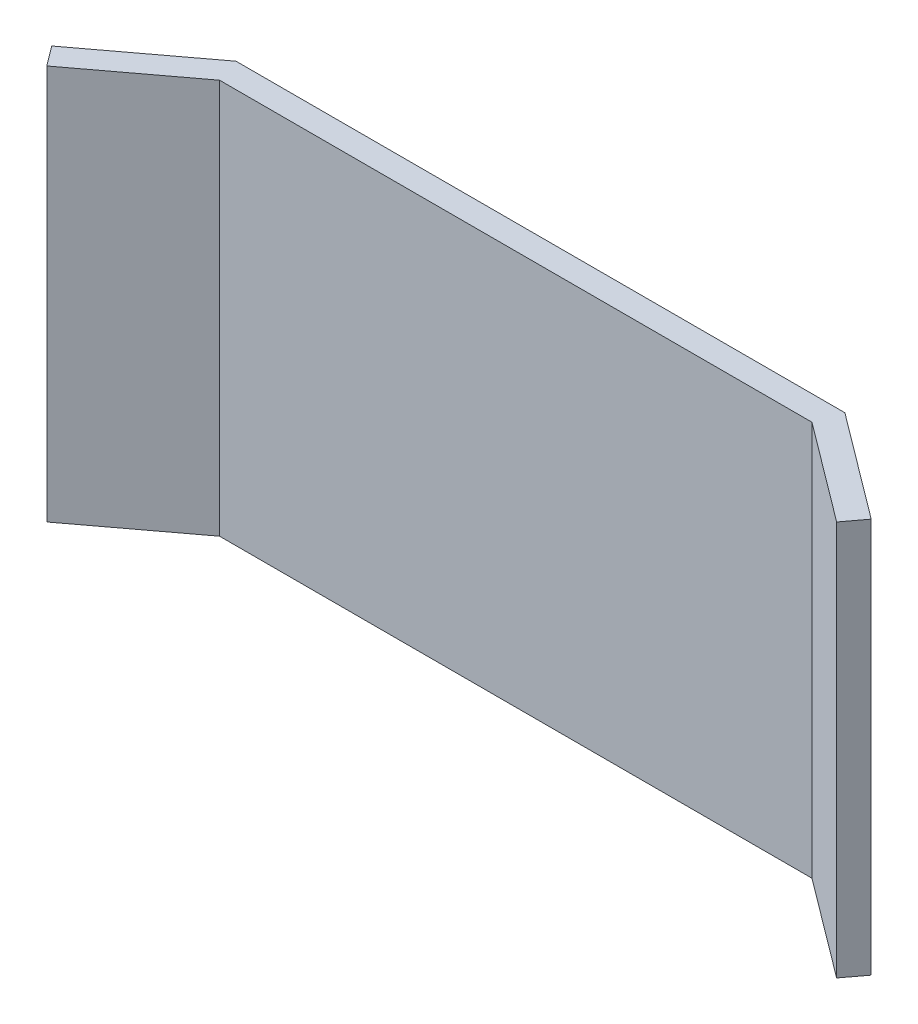
ISO-10303-21;
HEADER;
FILE_DESCRIPTION(('STEP AP214'),'2;1');
FILE_NAME('part.step','',(''),(''),'','','');
FILE_SCHEMA(('AUTOMOTIVE_DESIGN { 1 0 10303 214 1 1 1 1 }'));
ENDSEC;
DATA;
#1=APPLICATION_CONTEXT('core data for automotive mechanical design processes');
#2=APPLICATION_PROTOCOL_DEFINITION('international standard','automotive_design',2000,#1);
#3=PRODUCT_CONTEXT('',#1,'mechanical');
#4=PRODUCT('Part','Part','',(#3));
#5=PRODUCT_RELATED_PRODUCT_CATEGORY('part','',(#4));
#6=PRODUCT_DEFINITION_FORMATION('','',#4);
#7=PRODUCT_DEFINITION_CONTEXT('part definition',#1,'design');
#8=PRODUCT_DEFINITION('design','',#6,#7);
#9=PRODUCT_DEFINITION_SHAPE('','',#8);
#10=(LENGTH_UNIT() NAMED_UNIT(*) SI_UNIT(.MILLI.,.METRE.));
#11=(NAMED_UNIT(*) PLANE_ANGLE_UNIT() SI_UNIT($,.RADIAN.));
#12=(NAMED_UNIT(*) SI_UNIT($,.STERADIAN.) SOLID_ANGLE_UNIT());
#13=UNCERTAINTY_MEASURE_WITH_UNIT(LENGTH_MEASURE(1.E-05),#10,'distance_accuracy_value','');
#14=(GEOMETRIC_REPRESENTATION_CONTEXT(3) GLOBAL_UNCERTAINTY_ASSIGNED_CONTEXT((#13)) GLOBAL_UNIT_ASSIGNED_CONTEXT((#10,
#11,#12)) REPRESENTATION_CONTEXT('',''));
#15=CARTESIAN_POINT('',(0.,0.,0.));
#16=DIRECTION('',(0.,0.,1.));
#17=DIRECTION('',(1.,0.,0.));
#18=AXIS2_PLACEMENT_3D('',#15,#16,#17);
#19=CARTESIAN_POINT('',(-61.6666666666667,-80.,-4.99999999999999));
#20=DIRECTION('',(0.,0.,-1.));
#21=DIRECTION('',(-1.,0.,0.));
#22=AXIS2_PLACEMENT_3D('',#19,#20,#21);
#23=PLANE('',#22);
#24=DIRECTION('',(-1.,0.,0.));
#25=VECTOR('',#24,1.);
#26=CARTESIAN_POINT('',(-61.6666666666667,0.,-4.99999999999999));
#27=LINE('',#26,#25);
#28=CARTESIAN_POINT('',(61.6666666666667,0.,-4.99999999999999));
#29=VERTEX_POINT('',#28);
#30=CARTESIAN_POINT('',(-61.6666666666667,0.,-4.99999999999999));
#31=VERTEX_POINT('',#30);
#32=EDGE_CURVE('E169',#29,#31,#27,.T.);
#33=ORIENTED_EDGE('',*,*,#32,.F.);
#34=DIRECTION('',(0.,1.,0.));
#35=VECTOR('',#34,1.);
#36=CARTESIAN_POINT('',(61.6666666666667,-80.,-4.99999999999999));
#37=LINE('',#36,#35);
#38=CARTESIAN_POINT('',(61.6666666666667,-80.,-4.99999999999999));
#39=VERTEX_POINT('',#38);
#40=EDGE_CURVE('E194',#39,#29,#37,.T.);
#41=ORIENTED_EDGE('',*,*,#40,.F.);
#42=DIRECTION('',(-1.,0.,0.));
#43=VECTOR('',#42,1.);
#44=CARTESIAN_POINT('',(-61.6666666666667,-80.,-4.99999999999999));
#45=LINE('',#44,#43);
#46=CARTESIAN_POINT('',(-61.6666666666667,-80.,-4.99999999999999));
#47=VERTEX_POINT('',#46);
#48=EDGE_CURVE('E150',#39,#47,#45,.T.);
#49=ORIENTED_EDGE('',*,*,#48,.T.);
#50=DIRECTION('',(0.,1.,0.));
#51=VECTOR('',#50,1.);
#52=CARTESIAN_POINT('',(-61.6666666666667,-80.,-4.99999999999999));
#53=LINE('',#52,#51);
#54=EDGE_CURVE('E191',#47,#31,#53,.T.);
#55=ORIENTED_EDGE('',*,*,#54,.T.);
#56=EDGE_LOOP('',(#33,#41,#49,#55));
#57=FACE_BOUND('',#56,.T.);
#58=DIRECTION('',(-1.,0.,0.));
#59=VECTOR('',#58,1.);
#60=CARTESIAN_POINT('',(40.,-65.,-4.99999999999999));
#61=LINE('',#60,#59);
#62=CARTESIAN_POINT('',(40.,-65.,-4.99999999999999));
#63=VERTEX_POINT('',#62);
#64=CARTESIAN_POINT('',(-40.,-65.,-4.99999999999999));
#65=VERTEX_POINT('',#64);
#66=EDGE_CURVE('E395',#63,#65,#61,.T.);
#67=ORIENTED_EDGE('',*,*,#66,.F.);
#68=DIRECTION('',(0.,-1.,0.));
#69=VECTOR('',#68,1.);
#70=CARTESIAN_POINT('',(40.,-55.,-4.99999999999999));
#71=LINE('',#70,#69);
#72=CARTESIAN_POINT('',(40.,-55.,-4.99999999999999));
#73=VERTEX_POINT('',#72);
#74=EDGE_CURVE('E278',#73,#63,#71,.T.);
#75=ORIENTED_EDGE('',*,*,#74,.F.);
#76=DIRECTION('',(1.,0.,0.));
#77=VECTOR('',#76,1.);
#78=CARTESIAN_POINT('',(40.,-55.,-4.99999999999999));
#79=LINE('',#78,#77);
#80=CARTESIAN_POINT('',(-40.,-55.,-4.99999999999999));
#81=VERTEX_POINT('',#80);
#82=EDGE_CURVE('E272',#81,#73,#79,.T.);
#83=ORIENTED_EDGE('',*,*,#82,.F.);
#84=DIRECTION('',(0.,1.,0.));
#85=VECTOR('',#84,1.);
#86=CARTESIAN_POINT('',(-40.,-55.,-4.99999999999999));
#87=LINE('',#86,#85);
#88=EDGE_CURVE('E392',#65,#81,#87,.T.);
#89=ORIENTED_EDGE('',*,*,#88,.F.);
#90=EDGE_LOOP('',(#67,#75,#83,#89));
#91=FACE_BOUND('',#90,.T.);
#92=ADVANCED_FACE('F39',(#57,#91),#23,.T.);
#93=CARTESIAN_POINT('',(60.,-80.,0.));
#94=DIRECTION('',(-0.6,0.,0.8));
#95=DIRECTION('',(0.8,0.,0.6));
#96=AXIS2_PLACEMENT_3D('',#93,#94,#95);
#97=PLANE('',#96);
#98=DIRECTION('',(0.8,0.,0.6));
#99=VECTOR('',#98,1.);
#100=CARTESIAN_POINT('',(60.,0.,0.));
#101=LINE('',#100,#99);
#102=CARTESIAN_POINT('',(60.,0.,0.));
#103=VERTEX_POINT('',#102);
#104=CARTESIAN_POINT('',(80.,0.,15.));
#105=VERTEX_POINT('',#104);
#106=EDGE_CURVE('E156',#103,#105,#101,.T.);
#107=ORIENTED_EDGE('',*,*,#106,.F.);
#108=DIRECTION('',(0.,1.,0.));
#109=VECTOR('',#108,1.);
#110=CARTESIAN_POINT('',(60.,-80.,0.));
#111=LINE('',#110,#109);
#112=CARTESIAN_POINT('',(60.,-80.,0.));
#113=VERTEX_POINT('',#112);
#114=EDGE_CURVE('E11',#113,#103,#111,.T.);
#115=ORIENTED_EDGE('',*,*,#114,.F.);
#116=DIRECTION('',(0.8,0.,0.6));
#117=VECTOR('',#116,1.);
#118=CARTESIAN_POINT('',(60.,-80.,0.));
#119=LINE('',#118,#117);
#120=CARTESIAN_POINT('',(80.,-80.,15.));
#121=VERTEX_POINT('',#120);
#122=EDGE_CURVE('E185',#113,#121,#119,.T.);
#123=ORIENTED_EDGE('',*,*,#122,.T.);
#124=DIRECTION('',(0.,1.,0.));
#125=VECTOR('',#124,1.);
#126=CARTESIAN_POINT('',(80.,-80.,15.));
#127=LINE('',#126,#125);
#128=EDGE_CURVE('E43',#121,#105,#127,.T.);
#129=ORIENTED_EDGE('',*,*,#128,.T.);
#130=EDGE_LOOP('',(#107,#115,#123,#129));
#131=FACE_BOUND('',#130,.T.);
#132=ADVANCED_FACE('F41',(#131),#97,.T.);
#133=CARTESIAN_POINT('',(-60.,-80.,0.));
#134=DIRECTION('',(0.,0.,1.));
#135=DIRECTION('',(1.,0.,0.));
#136=AXIS2_PLACEMENT_3D('',#133,#134,#135);
#137=PLANE('',#136);
#138=DIRECTION('',(1.,0.,0.));
#139=VECTOR('',#138,1.);
#140=CARTESIAN_POINT('',(-60.,0.,0.));
#141=LINE('',#140,#139);
#142=CARTESIAN_POINT('',(-60.,0.,0.));
#143=VERTEX_POINT('',#142);
#144=EDGE_CURVE('E182',#143,#103,#141,.T.);
#145=ORIENTED_EDGE('',*,*,#144,.F.);
#146=DIRECTION('',(0.,1.,0.));
#147=VECTOR('',#146,1.);
#148=CARTESIAN_POINT('',(-60.,-80.,0.));
#149=LINE('',#148,#147);
#150=CARTESIAN_POINT('',(-60.,-80.,0.));
#151=VERTEX_POINT('',#150);
#152=EDGE_CURVE('E49',#151,#143,#149,.T.);
#153=ORIENTED_EDGE('',*,*,#152,.F.);
#154=DIRECTION('',(1.,0.,0.));
#155=VECTOR('',#154,1.);
#156=CARTESIAN_POINT('',(-60.,-80.,0.));
#157=LINE('',#156,#155);
#158=EDGE_CURVE('E142',#151,#113,#157,.T.);
#159=ORIENTED_EDGE('',*,*,#158,.T.);
#160=ORIENTED_EDGE('',*,*,#114,.T.);
#161=EDGE_LOOP('',(#145,#153,#159,#160));
#162=FACE_BOUND('',#161,.T.);
#163=ADVANCED_FACE('F203',(#162),#137,.T.);
#164=CARTESIAN_POINT('',(-60.,-80.,0.));
#165=DIRECTION('',(0.6,0.,0.8));
#166=DIRECTION('',(0.8,0.,-0.6));
#167=AXIS2_PLACEMENT_3D('',#164,#165,#166);
#168=PLANE('',#167);
#169=DIRECTION('',(0.8,0.,-0.6));
#170=VECTOR('',#169,1.);
#171=CARTESIAN_POINT('',(-60.,0.,0.));
#172=LINE('',#171,#170);
#173=CARTESIAN_POINT('',(-80.,0.,15.));
#174=VERTEX_POINT('',#173);
#175=EDGE_CURVE('E128',#174,#143,#172,.T.);
#176=ORIENTED_EDGE('',*,*,#175,.F.);
#177=DIRECTION('',(0.,1.,0.));
#178=VECTOR('',#177,1.);
#179=CARTESIAN_POINT('',(-80.,-80.,15.));
#180=LINE('',#179,#178);
#181=CARTESIAN_POINT('',(-80.,-80.,15.));
#182=VERTEX_POINT('',#181);
#183=EDGE_CURVE('E122',#182,#174,#180,.T.);
#184=ORIENTED_EDGE('',*,*,#183,.F.);
#185=DIRECTION('',(0.8,0.,-0.6));
#186=VECTOR('',#185,1.);
#187=CARTESIAN_POINT('',(-60.,-80.,0.));
#188=LINE('',#187,#186);
#189=EDGE_CURVE('E125',#182,#151,#188,.T.);
#190=ORIENTED_EDGE('',*,*,#189,.T.);
#191=ORIENTED_EDGE('',*,*,#152,.T.);
#192=EDGE_LOOP('',(#176,#184,#190,#191));
#193=FACE_BOUND('',#192,.T.);
#194=ADVANCED_FACE('F124',(#193),#168,.T.);
#195=CARTESIAN_POINT('',(-83.,-80.,11.));
#196=DIRECTION('',(-0.8,0.,0.6));
#197=DIRECTION('',(0.6,0.,0.8));
#198=AXIS2_PLACEMENT_3D('',#195,#196,#197);
#199=PLANE('',#198);
#200=DIRECTION('',(0.6,0.,0.8));
#201=VECTOR('',#200,1.);
#202=CARTESIAN_POINT('',(-83.,0.,11.));
#203=LINE('',#202,#201);
#204=CARTESIAN_POINT('',(-83.,0.,11.));
#205=VERTEX_POINT('',#204);
#206=EDGE_CURVE('E177',#205,#174,#203,.T.);
#207=ORIENTED_EDGE('',*,*,#206,.F.);
#208=DIRECTION('',(0.,1.,0.));
#209=VECTOR('',#208,1.);
#210=CARTESIAN_POINT('',(-83.,-80.,11.));
#211=LINE('',#210,#209);
#212=CARTESIAN_POINT('',(-83.,-80.,11.));
#213=VERTEX_POINT('',#212);
#214=EDGE_CURVE('E134',#213,#205,#211,.T.);
#215=ORIENTED_EDGE('',*,*,#214,.F.);
#216=DIRECTION('',(0.6,0.,0.8));
#217=VECTOR('',#216,1.);
#218=CARTESIAN_POINT('',(-83.,-80.,11.));
#219=LINE('',#218,#217);
#220=EDGE_CURVE('E140',#213,#182,#219,.T.);
#221=ORIENTED_EDGE('',*,*,#220,.T.);
#222=ORIENTED_EDGE('',*,*,#183,.T.);
#223=EDGE_LOOP('',(#207,#215,#221,#222));
#224=FACE_BOUND('',#223,.T.);
#225=ADVANCED_FACE('F145',(#224),#199,.T.);
#226=CARTESIAN_POINT('',(-61.6666666666667,-80.,-4.99999999999999));
#227=DIRECTION('',(-0.6,0.,-0.8));
#228=DIRECTION('',(-0.8,0.,0.6));
#229=AXIS2_PLACEMENT_3D('',#226,#227,#228);
#230=PLANE('',#229);
#231=DIRECTION('',(-0.8,0.,0.6));
#232=VECTOR('',#231,1.);
#233=CARTESIAN_POINT('',(-61.6666666666667,0.,-4.99999999999999));
#234=LINE('',#233,#232);
#235=EDGE_CURVE('E173',#31,#205,#234,.T.);
#236=ORIENTED_EDGE('',*,*,#235,.F.);
#237=ORIENTED_EDGE('',*,*,#54,.F.);
#238=DIRECTION('',(-0.8,0.,0.6));
#239=VECTOR('',#238,1.);
#240=CARTESIAN_POINT('',(-61.6666666666667,-80.,-4.99999999999999));
#241=LINE('',#240,#239);
#242=EDGE_CURVE('E147',#47,#213,#241,.T.);
#243=ORIENTED_EDGE('',*,*,#242,.T.);
#244=ORIENTED_EDGE('',*,*,#214,.T.);
#245=EDGE_LOOP('',(#236,#237,#243,#244));
#246=FACE_BOUND('',#245,.T.);
#247=ADVANCED_FACE('F221',(#246),#230,.T.);
#248=CARTESIAN_POINT('',(61.6666666666667,-80.,-4.99999999999999));
#249=DIRECTION('',(0.6,0.,-0.8));
#250=DIRECTION('',(-0.8,0.,-0.6));
#251=AXIS2_PLACEMENT_3D('',#248,#249,#250);
#252=PLANE('',#251);
#253=DIRECTION('',(-0.8,0.,-0.6));
#254=VECTOR('',#253,1.);
#255=CARTESIAN_POINT('',(61.6666666666667,0.,-4.99999999999999));
#256=LINE('',#255,#254);
#257=CARTESIAN_POINT('',(83.,0.,11.));
#258=VERTEX_POINT('',#257);
#259=EDGE_CURVE('E165',#258,#29,#256,.T.);
#260=ORIENTED_EDGE('',*,*,#259,.F.);
#261=DIRECTION('',(0.,1.,0.));
#262=VECTOR('',#261,1.);
#263=CARTESIAN_POINT('',(83.,-80.,11.));
#264=LINE('',#263,#262);
#265=CARTESIAN_POINT('',(83.,-80.,11.));
#266=VERTEX_POINT('',#265);
#267=EDGE_CURVE('E196',#266,#258,#264,.T.);
#268=ORIENTED_EDGE('',*,*,#267,.F.);
#269=DIRECTION('',(-0.8,0.,-0.6));
#270=VECTOR('',#269,1.);
#271=CARTESIAN_POINT('',(61.6666666666667,-80.,-4.99999999999999));
#272=LINE('',#271,#270);
#273=EDGE_CURVE('E294',#266,#39,#272,.T.);
#274=ORIENTED_EDGE('',*,*,#273,.T.);
#275=ORIENTED_EDGE('',*,*,#40,.T.);
#276=EDGE_LOOP('',(#260,#268,#274,#275));
#277=FACE_BOUND('',#276,.T.);
#278=ADVANCED_FACE('F223',(#277),#252,.T.);
#279=CARTESIAN_POINT('',(83.,-80.,11.));
#280=DIRECTION('',(0.799999999999998,0.,0.600000000000002));
#281=DIRECTION('',(0.600000000000002,0.,-0.799999999999998));
#282=AXIS2_PLACEMENT_3D('',#279,#280,#281);
#283=PLANE('',#282);
#284=DIRECTION('',(0.600000000000002,0.,-0.799999999999998));
#285=VECTOR('',#284,1.);
#286=CARTESIAN_POINT('',(83.,0.,11.));
#287=LINE('',#286,#285);
#288=EDGE_CURVE('E160',#105,#258,#287,.T.);
#289=ORIENTED_EDGE('',*,*,#288,.F.);
#290=ORIENTED_EDGE('',*,*,#128,.F.);
#291=DIRECTION('',(0.600000000000002,0.,-0.799999999999998));
#292=VECTOR('',#291,1.);
#293=CARTESIAN_POINT('',(83.,-80.,11.));
#294=LINE('',#293,#292);
#295=EDGE_CURVE('E291',#121,#266,#294,.T.);
#296=ORIENTED_EDGE('',*,*,#295,.T.);
#297=ORIENTED_EDGE('',*,*,#267,.T.);
#298=EDGE_LOOP('',(#289,#290,#296,#297));
#299=FACE_BOUND('',#298,.T.);
#300=ADVANCED_FACE('F200',(#299),#283,.T.);
#301=CARTESIAN_POINT('',(0.,-80.,0.));
#302=DIRECTION('',(0.,-1.,0.));
#303=DIRECTION('',(0.,0.,-1.));
#304=AXIS2_PLACEMENT_3D('',#301,#302,#303);
#305=PLANE('',#304);
#306=ORIENTED_EDGE('',*,*,#122,.F.);
#307=ORIENTED_EDGE('',*,*,#158,.F.);
#308=ORIENTED_EDGE('',*,*,#189,.F.);
#309=ORIENTED_EDGE('',*,*,#220,.F.);
#310=ORIENTED_EDGE('',*,*,#242,.F.);
#311=ORIENTED_EDGE('',*,*,#48,.F.);
#312=ORIENTED_EDGE('',*,*,#273,.F.);
#313=ORIENTED_EDGE('',*,*,#295,.F.);
#314=EDGE_LOOP('',(#306,#307,#308,#309,#310,#311,#312,#313));
#315=FACE_BOUND('',#314,.T.);
#316=ADVANCED_FACE('F138',(#315),#305,.T.);
#317=CARTESIAN_POINT('',(0.,0.,0.));
#318=DIRECTION('',(0.,-1.,0.));
#319=DIRECTION('',(0.,0.,-1.));
#320=AXIS2_PLACEMENT_3D('',#317,#318,#319);
#321=PLANE('',#320);
#322=ORIENTED_EDGE('',*,*,#106,.T.);
#323=ORIENTED_EDGE('',*,*,#288,.T.);
#324=ORIENTED_EDGE('',*,*,#259,.T.);
#325=ORIENTED_EDGE('',*,*,#32,.T.);
#326=ORIENTED_EDGE('',*,*,#235,.T.);
#327=ORIENTED_EDGE('',*,*,#206,.T.);
#328=ORIENTED_EDGE('',*,*,#175,.T.);
#329=ORIENTED_EDGE('',*,*,#144,.T.);
#330=EDGE_LOOP('',(#322,#323,#324,#325,#326,#327,#328,#329));
#331=FACE_BOUND('',#330,.T.);
#332=ADVANCED_FACE('F202',(#331),#321,.F.);
#333=CARTESIAN_POINT('',(40.,-55.,-30.));
#334=DIRECTION('',(-1.,0.,0.));
#335=DIRECTION('',(0.,0.,1.));
#336=AXIS2_PLACEMENT_3D('',#333,#334,#335);
#337=PLANE('',#336);
#338=ORIENTED_EDGE('',*,*,#74,.T.);
#339=DIRECTION('',(0.,0.,1.));
#340=VECTOR('',#339,1.);
#341=CARTESIAN_POINT('',(40.,-65.,-30.));
#342=LINE('',#341,#340);
#343=CARTESIAN_POINT('',(40.,-65.,-30.));
#344=VERTEX_POINT('',#343);
#345=EDGE_CURVE('E161',#344,#63,#342,.T.);
#346=ORIENTED_EDGE('',*,*,#345,.F.);
#347=DIRECTION('',(0.,-1.,0.));
#348=VECTOR('',#347,1.);
#349=CARTESIAN_POINT('',(40.,-55.,-30.));
#350=LINE('',#349,#348);
#351=CARTESIAN_POINT('',(40.,-55.,-30.));
#352=VERTEX_POINT('',#351);
#353=EDGE_CURVE('E260',#352,#344,#350,.T.);
#354=ORIENTED_EDGE('',*,*,#353,.F.);
#355=DIRECTION('',(0.,0.,1.));
#356=VECTOR('',#355,1.);
#357=CARTESIAN_POINT('',(40.,-55.,-30.));
#358=LINE('',#357,#356);
#359=EDGE_CURVE('E387',#352,#73,#358,.T.);
#360=ORIENTED_EDGE('',*,*,#359,.T.);
#361=EDGE_LOOP('',(#338,#346,#354,#360));
#362=FACE_BOUND('',#361,.T.);
#363=ADVANCED_FACE('F234',(#362),#337,.F.);
#364=CARTESIAN_POINT('',(40.,-65.,-30.));
#365=DIRECTION('',(0.,1.,0.));
#366=DIRECTION('',(0.,0.,1.));
#367=AXIS2_PLACEMENT_3D('',#364,#365,#366);
#368=PLANE('',#367);
#369=ORIENTED_EDGE('',*,*,#66,.T.);
#370=DIRECTION('',(0.,0.,1.));
#371=VECTOR('',#370,1.);
#372=CARTESIAN_POINT('',(-40.,-65.,-30.));
#373=LINE('',#372,#371);
#374=CARTESIAN_POINT('',(-40.,-65.,-30.));
#375=VERTEX_POINT('',#374);
#376=EDGE_CURVE('E282',#375,#65,#373,.T.);
#377=ORIENTED_EDGE('',*,*,#376,.F.);
#378=DIRECTION('',(-1.,0.,0.));
#379=VECTOR('',#378,1.);
#380=CARTESIAN_POINT('',(40.,-65.,-30.));
#381=LINE('',#380,#379);
#382=EDGE_CURVE('E265',#344,#375,#381,.T.);
#383=ORIENTED_EDGE('',*,*,#382,.F.);
#384=ORIENTED_EDGE('',*,*,#345,.T.);
#385=EDGE_LOOP('',(#369,#377,#383,#384));
#386=FACE_BOUND('',#385,.T.);
#387=ADVANCED_FACE('F238',(#386),#368,.F.);
#388=CARTESIAN_POINT('',(-40.,-55.,-30.));
#389=DIRECTION('',(1.,0.,0.));
#390=DIRECTION('',(0.,0.,-1.));
#391=AXIS2_PLACEMENT_3D('',#388,#389,#390);
#392=PLANE('',#391);
#393=ORIENTED_EDGE('',*,*,#88,.T.);
#394=DIRECTION('',(0.,0.,1.));
#395=VECTOR('',#394,1.);
#396=CARTESIAN_POINT('',(-40.,-55.,-30.));
#397=LINE('',#396,#395);
#398=CARTESIAN_POINT('',(-40.,-55.,-30.));
#399=VERTEX_POINT('',#398);
#400=EDGE_CURVE('E57',#399,#81,#397,.T.);
#401=ORIENTED_EDGE('',*,*,#400,.F.);
#402=DIRECTION('',(0.,1.,0.));
#403=VECTOR('',#402,1.);
#404=CARTESIAN_POINT('',(-40.,-55.,-30.));
#405=LINE('',#404,#403);
#406=EDGE_CURVE('E402',#375,#399,#405,.T.);
#407=ORIENTED_EDGE('',*,*,#406,.F.);
#408=ORIENTED_EDGE('',*,*,#376,.T.);
#409=EDGE_LOOP('',(#393,#401,#407,#408));
#410=FACE_BOUND('',#409,.T.);
#411=ADVANCED_FACE('F242',(#410),#392,.F.);
#412=CARTESIAN_POINT('',(40.,-55.,-30.));
#413=DIRECTION('',(0.,-1.,0.));
#414=DIRECTION('',(0.,0.,-1.));
#415=AXIS2_PLACEMENT_3D('',#412,#413,#414);
#416=PLANE('',#415);
#417=ORIENTED_EDGE('',*,*,#82,.T.);
#418=ORIENTED_EDGE('',*,*,#359,.F.);
#419=DIRECTION('',(1.,0.,0.));
#420=VECTOR('',#419,1.);
#421=CARTESIAN_POINT('',(40.,-55.,-30.));
#422=LINE('',#421,#420);
#423=EDGE_CURVE('E267',#399,#352,#422,.T.);
#424=ORIENTED_EDGE('',*,*,#423,.F.);
#425=ORIENTED_EDGE('',*,*,#400,.T.);
#426=EDGE_LOOP('',(#417,#418,#424,#425));
#427=FACE_BOUND('',#426,.T.);
#428=ADVANCED_FACE('F246',(#427),#416,.F.);
#429=CARTESIAN_POINT('',(0.,0.,-30.));
#430=DIRECTION('',(0.,0.,-1.));
#431=DIRECTION('',(-1.,0.,0.));
#432=AXIS2_PLACEMENT_3D('',#429,#430,#431);
#433=PLANE('',#432);
#434=ORIENTED_EDGE('',*,*,#353,.T.);
#435=ORIENTED_EDGE('',*,*,#382,.T.);
#436=ORIENTED_EDGE('',*,*,#406,.T.);
#437=ORIENTED_EDGE('',*,*,#423,.T.);
#438=EDGE_LOOP('',(#434,#435,#436,#437));
#439=FACE_BOUND('',#438,.T.);
#440=ADVANCED_FACE('F250',(#439),#433,.T.);
#441=CLOSED_SHELL('',(#92,#132,#163,#194,#225,#247,#278,#300,#316,#332,#363,#387,#411,#428,#440));
#442=MANIFOLD_SOLID_BREP('B2',#441);
#443=ADVANCED_BREP_SHAPE_REPRESENTATION('',(#18,#442),#14);
#444=SHAPE_DEFINITION_REPRESENTATION(#9,#443);
ENDSEC;
END-ISO-10303-21;
